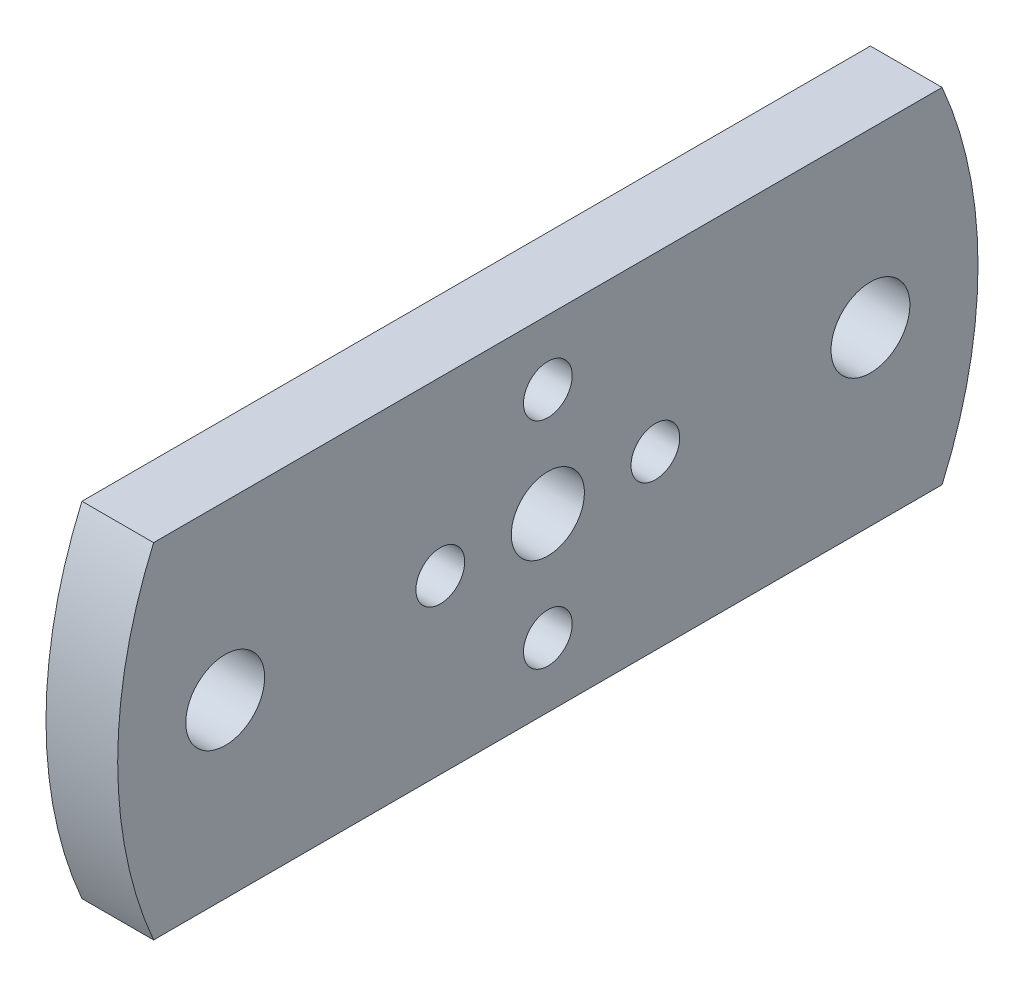
ISO-10303-21;
HEADER;
FILE_DESCRIPTION(('STEP AP214'),'2;1');
FILE_NAME('part.step','',(''),(''),'','','');
FILE_SCHEMA(('AUTOMOTIVE_DESIGN { 1 0 10303 214 1 1 1 1 }'));
ENDSEC;
DATA;
#1=APPLICATION_CONTEXT('core data for automotive mechanical design processes');
#2=APPLICATION_PROTOCOL_DEFINITION('international standard','automotive_design',2000,#1);
#3=PRODUCT_CONTEXT('',#1,'mechanical');
#4=PRODUCT('Part','Part','',(#3));
#5=PRODUCT_RELATED_PRODUCT_CATEGORY('part','',(#4));
#6=PRODUCT_DEFINITION_FORMATION('','',#4);
#7=PRODUCT_DEFINITION_CONTEXT('part definition',#1,'design');
#8=PRODUCT_DEFINITION('design','',#6,#7);
#9=PRODUCT_DEFINITION_SHAPE('','',#8);
#10=(LENGTH_UNIT() NAMED_UNIT(*) SI_UNIT(.MILLI.,.METRE.));
#11=(NAMED_UNIT(*) PLANE_ANGLE_UNIT() SI_UNIT($,.RADIAN.));
#12=(NAMED_UNIT(*) SI_UNIT($,.STERADIAN.) SOLID_ANGLE_UNIT());
#13=UNCERTAINTY_MEASURE_WITH_UNIT(LENGTH_MEASURE(1.E-05),#10,'distance_accuracy_value','');
#14=(GEOMETRIC_REPRESENTATION_CONTEXT(3) GLOBAL_UNCERTAINTY_ASSIGNED_CONTEXT((#13)) GLOBAL_UNIT_ASSIGNED_CONTEXT((#10,
#11,#12)) REPRESENTATION_CONTEXT('',''));
#15=CARTESIAN_POINT('',(0.,0.,0.));
#16=DIRECTION('',(0.,0.,1.));
#17=DIRECTION('',(1.,0.,0.));
#18=AXIS2_PLACEMENT_3D('',#15,#16,#17);
#19=CARTESIAN_POINT('',(12.2590701717541,107.1240091412,83.74151472549));
#20=DIRECTION('',(-1.,0.,0.));
#21=DIRECTION('',(0.,-1.,0.));
#22=AXIS2_PLACEMENT_3D('',#19,#20,#21);
#23=CYLINDRICAL_SURFACE('',#22,1.69999999999998);
#24=CARTESIAN_POINT('',(8.70907017175348,107.1240091412,83.74151472549));
#25=DIRECTION('',(-1.,0.,0.));
#26=DIRECTION('',(0.,0.,1.));
#27=AXIS2_PLACEMENT_3D('',#24,#25,#26);
#28=CIRCLE('',#27,1.69999999999956);
#29=CARTESIAN_POINT('',(8.70907017175348,107.1240091412,85.4415147254896));
#30=VERTEX_POINT('',#29);
#31=EDGE_CURVE('E74',#30,#30,#28,.F.);
#32=ORIENTED_EDGE('',*,*,#31,.F.);
#33=EDGE_LOOP('',(#32));
#34=FACE_BOUND('',#33,.T.);
#35=CARTESIAN_POINT('',(12.2590701717541,107.1240091412,83.74151472549));
#36=DIRECTION('',(-1.,0.,0.));
#37=DIRECTION('',(0.,-1.,0.));
#38=AXIS2_PLACEMENT_3D('',#35,#36,#37);
#39=CIRCLE('',#38,1.69999999999998);
#40=CARTESIAN_POINT('',(12.2590701717541,105.4240091412,83.74151472549));
#41=VERTEX_POINT('',#40);
#42=EDGE_CURVE('E80',#41,#41,#39,.F.);
#43=ORIENTED_EDGE('',*,*,#42,.T.);
#44=EDGE_LOOP('',(#43));
#45=FACE_BOUND('',#44,.T.);
#46=ADVANCED_FACE('F16',(#34,#45),#23,.F.);
#47=CARTESIAN_POINT('',(12.2590701717541,114.6240091412,91.24151472549));
#48=DIRECTION('',(-1.,0.,0.));
#49=DIRECTION('',(0.,-1.,0.));
#50=AXIS2_PLACEMENT_3D('',#47,#48,#49);
#51=CYLINDRICAL_SURFACE('',#50,1.69999999999998);
#52=CARTESIAN_POINT('',(8.70907017175348,114.6240091412,91.24151472549));
#53=DIRECTION('',(-1.,0.,0.));
#54=DIRECTION('',(0.,0.,1.));
#55=AXIS2_PLACEMENT_3D('',#52,#53,#54);
#56=CIRCLE('',#55,1.69999999999955);
#57=CARTESIAN_POINT('',(8.70907017175348,114.6240091412,92.9415147254895));
#58=VERTEX_POINT('',#57);
#59=EDGE_CURVE('E104',#58,#58,#56,.F.);
#60=ORIENTED_EDGE('',*,*,#59,.F.);
#61=EDGE_LOOP('',(#60));
#62=FACE_BOUND('',#61,.T.);
#63=CARTESIAN_POINT('',(12.2590701717541,114.6240091412,91.24151472549));
#64=DIRECTION('',(-1.,0.,0.));
#65=DIRECTION('',(0.,-1.,0.));
#66=AXIS2_PLACEMENT_3D('',#63,#64,#65);
#67=CIRCLE('',#66,1.69999999999998);
#68=CARTESIAN_POINT('',(12.2590701717541,112.9240091412,91.24151472549));
#69=VERTEX_POINT('',#68);
#70=EDGE_CURVE('E87',#69,#69,#67,.F.);
#71=ORIENTED_EDGE('',*,*,#70,.T.);
#72=EDGE_LOOP('',(#71));
#73=FACE_BOUND('',#72,.T.);
#74=ADVANCED_FACE('F167',(#62,#73),#51,.F.);
#75=CARTESIAN_POINT('',(12.2590701717541,107.1240091412,98.74151472549));
#76=DIRECTION('',(-1.,0.,0.));
#77=DIRECTION('',(0.,-1.,0.));
#78=AXIS2_PLACEMENT_3D('',#75,#76,#77);
#79=CYLINDRICAL_SURFACE('',#78,1.70000000001);
#80=CARTESIAN_POINT('',(8.70907017175348,107.1240091412,98.74151472549));
#81=DIRECTION('',(-1.,0.,0.));
#82=DIRECTION('',(0.,0.,1.));
#83=AXIS2_PLACEMENT_3D('',#80,#81,#82);
#84=CIRCLE('',#83,1.69999999998162);
#85=CARTESIAN_POINT('',(8.70907017175348,107.1240091412,100.441514725472));
#86=VERTEX_POINT('',#85);
#87=EDGE_CURVE('E100',#86,#86,#84,.F.);
#88=ORIENTED_EDGE('',*,*,#87,.F.);
#89=EDGE_LOOP('',(#88));
#90=FACE_BOUND('',#89,.T.);
#91=CARTESIAN_POINT('',(12.2590701717541,107.1240091412,98.74151472549));
#92=DIRECTION('',(-1.,0.,0.));
#93=DIRECTION('',(0.,-1.,0.));
#94=AXIS2_PLACEMENT_3D('',#91,#92,#93);
#95=CIRCLE('',#94,1.70000000001);
#96=CARTESIAN_POINT('',(12.2590701717541,105.42400914119,98.74151472549));
#97=VERTEX_POINT('',#96);
#98=EDGE_CURVE('E160',#97,#97,#95,.F.);
#99=ORIENTED_EDGE('',*,*,#98,.T.);
#100=EDGE_LOOP('',(#99));
#101=FACE_BOUND('',#100,.T.);
#102=ADVANCED_FACE('F183',(#90,#101),#79,.F.);
#103=CARTESIAN_POINT('',(12.2590701717541,99.62400914124,91.24151472549));
#104=DIRECTION('',(-1.,0.,0.));
#105=DIRECTION('',(0.,-1.,0.));
#106=AXIS2_PLACEMENT_3D('',#103,#104,#105);
#107=CYLINDRICAL_SURFACE('',#106,1.69999999999998);
#108=CARTESIAN_POINT('',(8.70907017175348,99.62400914124,91.24151472549));
#109=DIRECTION('',(-1.,0.,0.));
#110=DIRECTION('',(0.,0.,1.));
#111=AXIS2_PLACEMENT_3D('',#108,#109,#110);
#112=CIRCLE('',#111,1.69999999999955);
#113=CARTESIAN_POINT('',(8.70907017175348,99.62400914124,92.9415147254895));
#114=VERTEX_POINT('',#113);
#115=EDGE_CURVE('E93',#114,#114,#112,.F.);
#116=ORIENTED_EDGE('',*,*,#115,.F.);
#117=EDGE_LOOP('',(#116));
#118=FACE_BOUND('',#117,.T.);
#119=CARTESIAN_POINT('',(12.2590701717541,99.62400914124,91.24151472549));
#120=DIRECTION('',(-1.,0.,0.));
#121=DIRECTION('',(0.,-1.,0.));
#122=AXIS2_PLACEMENT_3D('',#119,#120,#121);
#123=CIRCLE('',#122,1.69999999999998);
#124=CARTESIAN_POINT('',(12.2590701717541,97.92400914124,91.24151472549));
#125=VERTEX_POINT('',#124);
#126=EDGE_CURVE('E156',#125,#125,#123,.F.);
#127=ORIENTED_EDGE('',*,*,#126,.T.);
#128=EDGE_LOOP('',(#127));
#129=FACE_BOUND('',#128,.T.);
#130=ADVANCED_FACE('F226',(#118,#129),#107,.F.);
#131=CARTESIAN_POINT('',(7.25907017175295,107.1240091412,91.24151472549));
#132=DIRECTION('',(1.,0.,0.));
#133=DIRECTION('',(0.,1.,0.));
#134=AXIS2_PLACEMENT_3D('',#131,#132,#133);
#135=CYLINDRICAL_SURFACE('',#134,30.);
#136=CARTESIAN_POINT('',(7.25907017175295,107.1240091412,91.24151472549));
#137=DIRECTION('',(1.,0.,0.));
#138=DIRECTION('',(0.,1.,0.));
#139=AXIS2_PLACEMENT_3D('',#136,#137,#138);
#140=CIRCLE('',#139,30.);
#141=CARTESIAN_POINT('',(7.25907017175317,95.1240091412396,118.736968895226));
#142=VERTEX_POINT('',#141);
#143=CARTESIAN_POINT('',(7.25907017175366,119.124009141201,118.736968895218));
#144=VERTEX_POINT('',#143);
#145=EDGE_CURVE('E69',#142,#144,#140,.F.);
#146=ORIENTED_EDGE('',*,*,#145,.F.);
#147=DIRECTION('',(1.,0.,0.));
#148=VECTOR('',#147,1.);
#149=CARTESIAN_POINT('',(9.75907017175199,95.12400914124,118.73696889521));
#150=LINE('',#149,#148);
#151=CARTESIAN_POINT('',(12.2590701717499,95.1240091412396,118.736968895226));
#152=VERTEX_POINT('',#151);
#153=EDGE_CURVE('E67',#142,#152,#150,.T.);
#154=ORIENTED_EDGE('',*,*,#153,.T.);
#155=CARTESIAN_POINT('',(12.2590701717499,107.1240091412,91.24151472549));
#156=DIRECTION('',(1.,0.,0.));
#157=DIRECTION('',(0.,1.,0.));
#158=AXIS2_PLACEMENT_3D('',#155,#156,#157);
#159=CIRCLE('',#158,30.);
#160=CARTESIAN_POINT('',(12.25907017175,119.1240091412,118.736968895218));
#161=VERTEX_POINT('',#160);
#162=EDGE_CURVE('E20',#152,#161,#159,.F.);
#163=ORIENTED_EDGE('',*,*,#162,.T.);
#164=DIRECTION('',(-1.,0.,0.));
#165=VECTOR('',#164,1.);
#166=CARTESIAN_POINT('',(9.75907017175199,119.1240091412,118.736968895211));
#167=LINE('',#166,#165);
#168=EDGE_CURVE('E94',#161,#144,#167,.T.);
#169=ORIENTED_EDGE('',*,*,#168,.T.);
#170=EDGE_LOOP('',(#146,#154,#163,#169));
#171=FACE_BOUND('',#170,.T.);
#172=ADVANCED_FACE('F68',(#171),#135,.T.);
#173=CARTESIAN_POINT('',(12.35907017175,95.12400914124,119.836787062));
#174=DIRECTION('',(0.,1.,0.));
#175=DIRECTION('',(0.,0.,-1.));
#176=AXIS2_PLACEMENT_3D('',#173,#174,#175);
#177=PLANE('',#176);
#178=DIRECTION('',(0.,0.,1.));
#179=VECTOR('',#178,1.);
#180=CARTESIAN_POINT('',(7.2590701717535,95.1240091412393,91.24919817662));
#181=LINE('',#180,#179);
#182=CARTESIAN_POINT('',(7.25907017175273,95.1240091412183,63.746060555747));
#183=VERTEX_POINT('',#182);
#184=EDGE_CURVE('E142',#183,#142,#181,.T.);
#185=ORIENTED_EDGE('',*,*,#184,.F.);
#186=DIRECTION('',(1.,0.,0.));
#187=VECTOR('',#186,1.);
#188=CARTESIAN_POINT('',(9.7590701717515,95.1240091411973,63.7460605557561));
#189=LINE('',#188,#187);
#190=CARTESIAN_POINT('',(12.2590701717499,95.1240091412183,63.746060555747));
#191=VERTEX_POINT('',#190);
#192=EDGE_CURVE('E65',#183,#191,#189,.T.);
#193=ORIENTED_EDGE('',*,*,#192,.T.);
#194=DIRECTION('',(0.,0.,1.));
#195=VECTOR('',#194,1.);
#196=CARTESIAN_POINT('',(12.25907017175,95.1240091412393,91.24919817662));
#197=LINE('',#196,#195);
#198=EDGE_CURVE('E59',#191,#152,#197,.T.);
#199=ORIENTED_EDGE('',*,*,#198,.T.);
#200=ORIENTED_EDGE('',*,*,#153,.F.);
#201=EDGE_LOOP('',(#185,#193,#199,#200));
#202=FACE_BOUND('',#201,.T.);
#203=ADVANCED_FACE('F77',(#202),#177,.F.);
#204=CARTESIAN_POINT('',(8.70907017175348,107.1240091412,83.74151472549));
#205=DIRECTION('',(-1.,0.,0.));
#206=DIRECTION('',(0.,0.,1.));
#207=AXIS2_PLACEMENT_3D('',#204,#205,#206);
#208=CONICAL_SURFACE('',#207,1.69999999999955,0.785398163397762);
#209=CARTESIAN_POINT('',(7.25907017175348,107.1240091412,83.74151472549));
#210=DIRECTION('',(-1.,0.,0.));
#211=DIRECTION('',(0.,0.,1.));
#212=AXIS2_PLACEMENT_3D('',#209,#210,#211);
#213=CIRCLE('',#212,3.15000000000046);
#214=CARTESIAN_POINT('',(7.25907017175348,107.1240091412,86.8915147254905));
#215=VERTEX_POINT('',#214);
#216=EDGE_CURVE('E138',#215,#215,#213,.F.);
#217=ORIENTED_EDGE('',*,*,#216,.F.);
#218=EDGE_LOOP('',(#217));
#219=FACE_BOUND('',#218,.T.);
#220=ORIENTED_EDGE('',*,*,#31,.T.);
#221=EDGE_LOOP('',(#220));
#222=FACE_BOUND('',#221,.T.);
#223=ADVANCED_FACE('F219',(#219,#222),#208,.F.);
#224=CARTESIAN_POINT('',(8.70907017175348,114.6240091412,91.24151472549));
#225=DIRECTION('',(-1.,0.,0.));
#226=DIRECTION('',(0.,0.,1.));
#227=AXIS2_PLACEMENT_3D('',#224,#225,#226);
#228=CONICAL_SURFACE('',#227,1.69999999999956,0.785398163397768);
#229=CARTESIAN_POINT('',(7.2590701717535,114.6240091412,91.24151472549));
#230=DIRECTION('',(-1.,0.,0.));
#231=DIRECTION('',(0.,0.,1.));
#232=AXIS2_PLACEMENT_3D('',#229,#230,#231);
#233=CIRCLE('',#232,3.15000000000047);
#234=CARTESIAN_POINT('',(7.2590701717535,114.6240091412,94.3915147254905));
#235=VERTEX_POINT('',#234);
#236=EDGE_CURVE('E134',#235,#235,#233,.F.);
#237=ORIENTED_EDGE('',*,*,#236,.F.);
#238=EDGE_LOOP('',(#237));
#239=FACE_BOUND('',#238,.T.);
#240=ORIENTED_EDGE('',*,*,#59,.T.);
#241=EDGE_LOOP('',(#240));
#242=FACE_BOUND('',#241,.T.);
#243=ADVANCED_FACE('F215',(#239,#242),#228,.F.);
#244=CARTESIAN_POINT('',(8.70907017175347,107.1240091412,98.74151472549));
#245=DIRECTION('',(-1.,0.,0.));
#246=DIRECTION('',(0.,0.,1.));
#247=AXIS2_PLACEMENT_3D('',#244,#245,#246);
#248=CONICAL_SURFACE('',#247,1.69999999998163,0.785398163417007);
#249=CARTESIAN_POINT('',(7.2590701717535,107.1240091412,98.74151472549));
#250=DIRECTION('',(-1.,0.,0.));
#251=DIRECTION('',(0.,0.,1.));
#252=AXIS2_PLACEMENT_3D('',#249,#250,#251);
#253=CIRCLE('',#252,3.15000000003833);
#254=CARTESIAN_POINT('',(7.2590701717535,107.1240091412,101.891514725528));
#255=VERTEX_POINT('',#254);
#256=EDGE_CURVE('E130',#255,#255,#253,.F.);
#257=ORIENTED_EDGE('',*,*,#256,.F.);
#258=EDGE_LOOP('',(#257));
#259=FACE_BOUND('',#258,.T.);
#260=ORIENTED_EDGE('',*,*,#87,.T.);
#261=EDGE_LOOP('',(#260));
#262=FACE_BOUND('',#261,.T.);
#263=ADVANCED_FACE('F211',(#259,#262),#248,.F.);
#264=CARTESIAN_POINT('',(8.7090701717535,99.62400914124,91.24151472549));
#265=DIRECTION('',(-1.,0.,0.));
#266=DIRECTION('',(0.,0.,1.));
#267=AXIS2_PLACEMENT_3D('',#264,#265,#266);
#268=CONICAL_SURFACE('',#267,1.69999999999955,0.785398163397763);
#269=CARTESIAN_POINT('',(7.25907017175351,99.62400914124,91.24151472549));
#270=DIRECTION('',(-1.,0.,0.));
#271=DIRECTION('',(0.,0.,1.));
#272=AXIS2_PLACEMENT_3D('',#269,#270,#271);
#273=CIRCLE('',#272,3.15000000000044);
#274=CARTESIAN_POINT('',(7.25907017175351,99.62400914124,94.3915147254904));
#275=VERTEX_POINT('',#274);
#276=EDGE_CURVE('E126',#275,#275,#273,.F.);
#277=ORIENTED_EDGE('',*,*,#276,.F.);
#278=EDGE_LOOP('',(#277));
#279=FACE_BOUND('',#278,.T.);
#280=ORIENTED_EDGE('',*,*,#115,.T.);
#281=EDGE_LOOP('',(#280));
#282=FACE_BOUND('',#281,.T.);
#283=ADVANCED_FACE('F207',(#279,#282),#268,.F.);
#284=CARTESIAN_POINT('',(7.25907017175393,107.1240091412,113.7415147255));
#285=DIRECTION('',(1.,0.,0.));
#286=DIRECTION('',(0.,0.,-1.));
#287=AXIS2_PLACEMENT_3D('',#284,#285,#286);
#288=CYLINDRICAL_SURFACE('',#287,2.75000000000001);
#289=CARTESIAN_POINT('',(7.25907017175393,107.1240091412,113.7415147255));
#290=DIRECTION('',(1.,0.,0.));
#291=DIRECTION('',(0.,0.,-1.));
#292=AXIS2_PLACEMENT_3D('',#289,#290,#291);
#293=CIRCLE('',#292,2.75000000000001);
#294=CARTESIAN_POINT('',(7.25907017175393,107.1240091412,110.9915147255));
#295=VERTEX_POINT('',#294);
#296=EDGE_CURVE('E122',#295,#295,#293,.T.);
#297=ORIENTED_EDGE('',*,*,#296,.F.);
#298=EDGE_LOOP('',(#297));
#299=FACE_BOUND('',#298,.T.);
#300=CARTESIAN_POINT('',(12.2590701717499,107.1240091412,113.7415147255));
#301=DIRECTION('',(1.,0.,0.));
#302=DIRECTION('',(0.,0.,-1.));
#303=AXIS2_PLACEMENT_3D('',#300,#301,#302);
#304=CIRCLE('',#303,2.75000000000001);
#305=CARTESIAN_POINT('',(12.2590701717499,107.1240091412,110.9915147255));
#306=VERTEX_POINT('',#305);
#307=EDGE_CURVE('E148',#306,#306,#304,.T.);
#308=ORIENTED_EDGE('',*,*,#307,.T.);
#309=EDGE_LOOP('',(#308));
#310=FACE_BOUND('',#309,.T.);
#311=ADVANCED_FACE('F203',(#299,#310),#288,.F.);
#312=CARTESIAN_POINT('',(7.25907017175295,107.1240091412,91.24151472549));
#313=DIRECTION('',(1.,0.,0.));
#314=DIRECTION('',(0.,1.,0.));
#315=AXIS2_PLACEMENT_3D('',#312,#313,#314);
#316=CYLINDRICAL_SURFACE('',#315,2.54999999999998);
#317=CARTESIAN_POINT('',(7.25907017175295,107.1240091412,91.24151472549));
#318=DIRECTION('',(1.,0.,0.));
#319=DIRECTION('',(0.,1.,0.));
#320=AXIS2_PLACEMENT_3D('',#317,#318,#319);
#321=CIRCLE('',#320,2.54999999999998);
#322=CARTESIAN_POINT('',(7.25907017175294,109.6740091412,91.24151472549));
#323=VERTEX_POINT('',#322);
#324=EDGE_CURVE('E118',#323,#323,#321,.T.);
#325=ORIENTED_EDGE('',*,*,#324,.F.);
#326=EDGE_LOOP('',(#325));
#327=FACE_BOUND('',#326,.T.);
#328=CARTESIAN_POINT('',(12.2590701717499,107.1240091412,91.24151472549));
#329=DIRECTION('',(1.,0.,0.));
#330=DIRECTION('',(0.,1.,0.));
#331=AXIS2_PLACEMENT_3D('',#328,#329,#330);
#332=CIRCLE('',#331,2.54999999999998);
#333=CARTESIAN_POINT('',(12.2590701717499,109.6740091412,91.24151472549));
#334=VERTEX_POINT('',#333);
#335=EDGE_CURVE('E152',#334,#334,#332,.T.);
#336=ORIENTED_EDGE('',*,*,#335,.T.);
#337=EDGE_LOOP('',(#336));
#338=FACE_BOUND('',#337,.T.);
#339=ADVANCED_FACE('F199',(#327,#338),#316,.F.);
#340=CARTESIAN_POINT('',(7.25907017175295,107.1240091412,68.74151472549));
#341=DIRECTION('',(1.,0.,0.));
#342=DIRECTION('',(0.,1.,0.));
#343=AXIS2_PLACEMENT_3D('',#340,#341,#342);
#344=CYLINDRICAL_SURFACE('',#343,2.75);
#345=CARTESIAN_POINT('',(7.25907017175295,107.1240091412,68.74151472549));
#346=DIRECTION('',(1.,0.,0.));
#347=DIRECTION('',(0.,1.,0.));
#348=AXIS2_PLACEMENT_3D('',#345,#346,#347);
#349=CIRCLE('',#348,2.75);
#350=CARTESIAN_POINT('',(7.25907017175294,109.8740091412,68.74151472549));
#351=VERTEX_POINT('',#350);
#352=EDGE_CURVE('E114',#351,#351,#349,.T.);
#353=ORIENTED_EDGE('',*,*,#352,.F.);
#354=EDGE_LOOP('',(#353));
#355=FACE_BOUND('',#354,.T.);
#356=CARTESIAN_POINT('',(12.2590701717499,107.1240091412,68.74151472549));
#357=DIRECTION('',(1.,0.,0.));
#358=DIRECTION('',(0.,1.,0.));
#359=AXIS2_PLACEMENT_3D('',#356,#357,#358);
#360=CIRCLE('',#359,2.75);
#361=CARTESIAN_POINT('',(12.2590701717499,109.8740091412,68.74151472549));
#362=VERTEX_POINT('',#361);
#363=EDGE_CURVE('E145',#362,#362,#360,.T.);
#364=ORIENTED_EDGE('',*,*,#363,.T.);
#365=EDGE_LOOP('',(#364));
#366=FACE_BOUND('',#365,.T.);
#367=ADVANCED_FACE('F172',(#355,#366),#344,.F.);
#368=CARTESIAN_POINT('',(12.25907017175,94.64400914124,60.04120738744));
#369=DIRECTION('',(-1.,0.,0.));
#370=DIRECTION('',(0.,0.,1.));
#371=AXIS2_PLACEMENT_3D('',#368,#369,#370);
#372=PLANE('',#371);
#373=ORIENTED_EDGE('',*,*,#363,.F.);
#374=EDGE_LOOP('',(#373));
#375=FACE_BOUND('',#374,.T.);
#376=ORIENTED_EDGE('',*,*,#307,.F.);
#377=EDGE_LOOP('',(#376));
#378=FACE_BOUND('',#377,.T.);
#379=ORIENTED_EDGE('',*,*,#335,.F.);
#380=EDGE_LOOP('',(#379));
#381=FACE_BOUND('',#380,.T.);
#382=ORIENTED_EDGE('',*,*,#126,.F.);
#383=EDGE_LOOP('',(#382));
#384=FACE_BOUND('',#383,.T.);
#385=ORIENTED_EDGE('',*,*,#98,.F.);
#386=EDGE_LOOP('',(#385));
#387=FACE_BOUND('',#386,.T.);
#388=ORIENTED_EDGE('',*,*,#70,.F.);
#389=EDGE_LOOP('',(#388));
#390=FACE_BOUND('',#389,.T.);
#391=ORIENTED_EDGE('',*,*,#42,.F.);
#392=EDGE_LOOP('',(#391));
#393=FACE_BOUND('',#392,.T.);
#394=ORIENTED_EDGE('',*,*,#198,.F.);
#395=CARTESIAN_POINT('',(12.2590701717499,107.1240091412,91.24151472549));
#396=DIRECTION('',(1.,0.,0.));
#397=DIRECTION('',(0.,1.,0.));
#398=AXIS2_PLACEMENT_3D('',#395,#396,#397);
#399=CIRCLE('',#398,30.);
#400=CARTESIAN_POINT('',(12.2590701717499,119.1240091412,63.746060555755));
#401=VERTEX_POINT('',#400);
#402=EDGE_CURVE('E111',#191,#401,#399,.T.);
#403=ORIENTED_EDGE('',*,*,#402,.T.);
#404=DIRECTION('',(0.,0.,1.));
#405=VECTOR('',#404,1.);
#406=CARTESIAN_POINT('',(12.2590701717501,119.1240091412,91.24151472548));
#407=LINE('',#406,#405);
#408=EDGE_CURVE('E60',#401,#161,#407,.T.);
#409=ORIENTED_EDGE('',*,*,#408,.T.);
#410=ORIENTED_EDGE('',*,*,#162,.F.);
#411=EDGE_LOOP('',(#394,#403,#409,#410));
#412=FACE_BOUND('',#411,.T.);
#413=ADVANCED_FACE('F56',(#375,#378,#381,#384,#387,#390,#393,#412),#372,.F.);
#414=CARTESIAN_POINT('',(12.35907017175,119.1240091412,62.64624238896));
#415=DIRECTION('',(0.,-1.,0.));
#416=DIRECTION('',(0.,0.,1.));
#417=AXIS2_PLACEMENT_3D('',#414,#415,#416);
#418=PLANE('',#417);
#419=DIRECTION('',(0.,0.,-1.));
#420=VECTOR('',#419,1.);
#421=CARTESIAN_POINT('',(7.2590701717535,119.124009141201,91.24919817662));
#422=LINE('',#421,#420);
#423=CARTESIAN_POINT('',(7.25907017175273,119.124009141201,63.7460605557552));
#424=VERTEX_POINT('',#423);
#425=EDGE_CURVE('E35',#144,#424,#422,.T.);
#426=ORIENTED_EDGE('',*,*,#425,.F.);
#427=ORIENTED_EDGE('',*,*,#168,.F.);
#428=ORIENTED_EDGE('',*,*,#408,.F.);
#429=DIRECTION('',(-1.,0.,0.));
#430=VECTOR('',#429,1.);
#431=CARTESIAN_POINT('',(9.7590701717515,119.1240091412,63.7460605557551));
#432=LINE('',#431,#430);
#433=EDGE_CURVE('E27',#401,#424,#432,.T.);
#434=ORIENTED_EDGE('',*,*,#433,.T.);
#435=EDGE_LOOP('',(#426,#427,#428,#434));
#436=FACE_BOUND('',#435,.T.);
#437=ADVANCED_FACE('F171',(#436),#418,.F.);
#438=CARTESIAN_POINT('',(7.259070171753,94.64400914124,60.04120738744));
#439=DIRECTION('',(-1.,0.,0.));
#440=DIRECTION('',(0.,0.,1.));
#441=AXIS2_PLACEMENT_3D('',#438,#439,#440);
#442=PLANE('',#441);
#443=ORIENTED_EDGE('',*,*,#352,.T.);
#444=EDGE_LOOP('',(#443));
#445=FACE_BOUND('',#444,.T.);
#446=ORIENTED_EDGE('',*,*,#324,.T.);
#447=EDGE_LOOP('',(#446));
#448=FACE_BOUND('',#447,.T.);
#449=ORIENTED_EDGE('',*,*,#296,.T.);
#450=EDGE_LOOP('',(#449));
#451=FACE_BOUND('',#450,.T.);
#452=ORIENTED_EDGE('',*,*,#276,.T.);
#453=EDGE_LOOP('',(#452));
#454=FACE_BOUND('',#453,.T.);
#455=ORIENTED_EDGE('',*,*,#256,.T.);
#456=EDGE_LOOP('',(#455));
#457=FACE_BOUND('',#456,.T.);
#458=ORIENTED_EDGE('',*,*,#236,.T.);
#459=EDGE_LOOP('',(#458));
#460=FACE_BOUND('',#459,.T.);
#461=ORIENTED_EDGE('',*,*,#216,.T.);
#462=EDGE_LOOP('',(#461));
#463=FACE_BOUND('',#462,.T.);
#464=CARTESIAN_POINT('',(7.25907017175295,107.1240091412,91.24151472549));
#465=DIRECTION('',(1.,0.,0.));
#466=DIRECTION('',(0.,1.,0.));
#467=AXIS2_PLACEMENT_3D('',#464,#465,#466);
#468=CIRCLE('',#467,30.);
#469=EDGE_CURVE('E11',#424,#183,#468,.F.);
#470=ORIENTED_EDGE('',*,*,#469,.T.);
#471=ORIENTED_EDGE('',*,*,#184,.T.);
#472=ORIENTED_EDGE('',*,*,#145,.T.);
#473=ORIENTED_EDGE('',*,*,#425,.T.);
#474=EDGE_LOOP('',(#470,#471,#472,#473));
#475=FACE_BOUND('',#474,.T.);
#476=ADVANCED_FACE('F18',(#445,#448,#451,#454,#457,#460,#463,#475),#442,.T.);
#477=CARTESIAN_POINT('',(7.25907017175295,107.1240091412,91.24151472549));
#478=DIRECTION('',(1.,0.,0.));
#479=DIRECTION('',(0.,1.,0.));
#480=AXIS2_PLACEMENT_3D('',#477,#478,#479);
#481=CYLINDRICAL_SURFACE('',#480,30.);
#482=ORIENTED_EDGE('',*,*,#433,.F.);
#483=ORIENTED_EDGE('',*,*,#402,.F.);
#484=ORIENTED_EDGE('',*,*,#192,.F.);
#485=ORIENTED_EDGE('',*,*,#469,.F.);
#486=EDGE_LOOP('',(#482,#483,#484,#485));
#487=FACE_BOUND('',#486,.T.);
#488=ADVANCED_FACE('F188',(#487),#481,.T.);
#489=CLOSED_SHELL('',(#46,#74,#102,#130,#172,#203,#223,#243,#263,#283,#311,#339,#367,#413,#437,
#476,#488));
#490=MANIFOLD_SOLID_BREP('B1',#489);
#491=ADVANCED_BREP_SHAPE_REPRESENTATION('',(#18,#490),#14);
#492=SHAPE_DEFINITION_REPRESENTATION(#9,#491);
ENDSEC;
END-ISO-10303-21;
